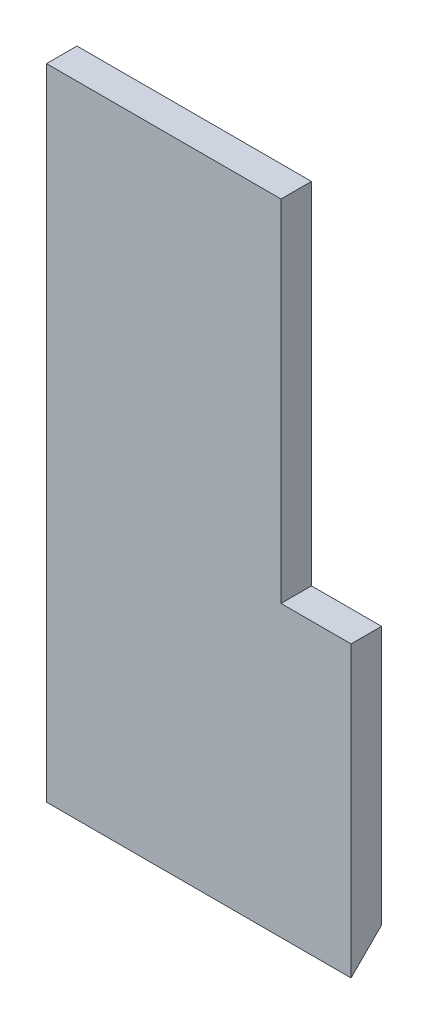
ISO-10303-21;
HEADER;
FILE_DESCRIPTION(('STEP AP214'),'2;1');
FILE_NAME('part.step','',(''),(''),'','','');
FILE_SCHEMA(('AUTOMOTIVE_DESIGN { 1 0 10303 214 1 1 1 1 }'));
ENDSEC;
DATA;
#1=APPLICATION_CONTEXT('core data for automotive mechanical design processes');
#2=APPLICATION_PROTOCOL_DEFINITION('international standard','automotive_design',2000,#1);
#3=PRODUCT_CONTEXT('',#1,'mechanical');
#4=PRODUCT('Part','Part','',(#3));
#5=PRODUCT_RELATED_PRODUCT_CATEGORY('part','',(#4));
#6=PRODUCT_DEFINITION_FORMATION('','',#4);
#7=PRODUCT_DEFINITION_CONTEXT('part definition',#1,'design');
#8=PRODUCT_DEFINITION('design','',#6,#7);
#9=PRODUCT_DEFINITION_SHAPE('','',#8);
#10=(LENGTH_UNIT() NAMED_UNIT(*) SI_UNIT(.MILLI.,.METRE.));
#11=(NAMED_UNIT(*) PLANE_ANGLE_UNIT() SI_UNIT($,.RADIAN.));
#12=(NAMED_UNIT(*) SI_UNIT($,.STERADIAN.) SOLID_ANGLE_UNIT());
#13=UNCERTAINTY_MEASURE_WITH_UNIT(LENGTH_MEASURE(1.E-05),#10,'distance_accuracy_value','');
#14=(GEOMETRIC_REPRESENTATION_CONTEXT(3) GLOBAL_UNCERTAINTY_ASSIGNED_CONTEXT((#13)) GLOBAL_UNIT_ASSIGNED_CONTEXT((#10,
#11,#12)) REPRESENTATION_CONTEXT('',''));
#15=CARTESIAN_POINT('',(0.,0.,0.));
#16=DIRECTION('',(0.,0.,1.));
#17=DIRECTION('',(1.,0.,0.));
#18=AXIS2_PLACEMENT_3D('',#15,#16,#17);
#19=CARTESIAN_POINT('',(-50.,-105.,10.));
#20=DIRECTION('',(-1.,0.,0.));
#21=DIRECTION('',(0.,0.,1.));
#22=AXIS2_PLACEMENT_3D('',#19,#20,#21);
#23=PLANE('',#22);
#24=DIRECTION('',(0.,-0.707106781186548,0.707106781186547));
#25=VECTOR('',#24,1.);
#26=CARTESIAN_POINT('',(-50.,-105.,10.));
#27=LINE('',#26,#25);
#28=CARTESIAN_POINT('',(-50.,-95.,0.));
#29=VERTEX_POINT('',#28);
#30=CARTESIAN_POINT('',(-50.,-105.,10.));
#31=VERTEX_POINT('',#30);
#32=EDGE_CURVE('E48',#29,#31,#27,.T.);
#33=ORIENTED_EDGE('',*,*,#32,.T.);
#34=DIRECTION('',(0.,1.,0.));
#35=VECTOR('',#34,1.);
#36=CARTESIAN_POINT('',(-50.,-105.,10.));
#37=LINE('',#36,#35);
#38=CARTESIAN_POINT('',(-50.,105.,10.));
#39=VERTEX_POINT('',#38);
#40=EDGE_CURVE('E102',#31,#39,#37,.T.);
#41=ORIENTED_EDGE('',*,*,#40,.T.);
#42=DIRECTION('',(0.,0.,-1.));
#43=VECTOR('',#42,1.);
#44=CARTESIAN_POINT('',(-50.,105.,10.));
#45=LINE('',#44,#43);
#46=CARTESIAN_POINT('',(-50.,105.,0.));
#47=VERTEX_POINT('',#46);
#48=EDGE_CURVE('E35',#39,#47,#45,.T.);
#49=ORIENTED_EDGE('',*,*,#48,.T.);
#50=DIRECTION('',(0.,1.,0.));
#51=VECTOR('',#50,1.);
#52=CARTESIAN_POINT('',(-50.,-105.,0.));
#53=LINE('',#52,#51);
#54=EDGE_CURVE('E103',#29,#47,#53,.T.);
#55=ORIENTED_EDGE('',*,*,#54,.F.);
#56=EDGE_LOOP('',(#33,#41,#49,#55));
#57=FACE_BOUND('',#56,.T.);
#58=ADVANCED_FACE('F32',(#57),#23,.T.);
#59=CARTESIAN_POINT('',(50.,-105.,10.));
#60=DIRECTION('',(-1.,0.,0.));
#61=DIRECTION('',(0.,0.,1.));
#62=AXIS2_PLACEMENT_3D('',#59,#60,#61);
#63=PLANE('',#62);
#64=DIRECTION('',(0.,1.,0.));
#65=VECTOR('',#64,1.);
#66=CARTESIAN_POINT('',(50.,-105.,10.));
#67=LINE('',#66,#65);
#68=CARTESIAN_POINT('',(50.,-105.,10.));
#69=VERTEX_POINT('',#68);
#70=CARTESIAN_POINT('',(50.,-10.,10.));
#71=VERTEX_POINT('',#70);
#72=EDGE_CURVE('E57',#69,#71,#67,.T.);
#73=ORIENTED_EDGE('',*,*,#72,.F.);
#74=DIRECTION('',(0.,-0.707106781186548,0.707106781186547));
#75=VECTOR('',#74,1.);
#76=CARTESIAN_POINT('',(50.,-105.,10.));
#77=LINE('',#76,#75);
#78=CARTESIAN_POINT('',(50.,-95.,0.));
#79=VERTEX_POINT('',#78);
#80=EDGE_CURVE('E96',#79,#69,#77,.T.);
#81=ORIENTED_EDGE('',*,*,#80,.F.);
#82=DIRECTION('',(0.,1.,0.));
#83=VECTOR('',#82,1.);
#84=CARTESIAN_POINT('',(50.,-105.,0.));
#85=LINE('',#84,#83);
#86=CARTESIAN_POINT('',(50.,-10.,0.));
#87=VERTEX_POINT('',#86);
#88=EDGE_CURVE('E79',#79,#87,#85,.T.);
#89=ORIENTED_EDGE('',*,*,#88,.T.);
#90=DIRECTION('',(0.,0.,-1.));
#91=VECTOR('',#90,1.);
#92=CARTESIAN_POINT('',(50.,-10.,10.));
#93=LINE('',#92,#91);
#94=EDGE_CURVE('E11',#71,#87,#93,.T.);
#95=ORIENTED_EDGE('',*,*,#94,.F.);
#96=EDGE_LOOP('',(#73,#81,#89,#95));
#97=FACE_BOUND('',#96,.T.);
#98=ADVANCED_FACE('F137',(#97),#63,.F.);
#99=CARTESIAN_POINT('',(27.,-10.,10.));
#100=DIRECTION('',(0.,1.,0.));
#101=DIRECTION('',(0.,0.,1.));
#102=AXIS2_PLACEMENT_3D('',#99,#100,#101);
#103=PLANE('',#102);
#104=DIRECTION('',(1.,0.,0.));
#105=VECTOR('',#104,1.);
#106=CARTESIAN_POINT('',(27.,-10.,0.));
#107=LINE('',#106,#105);
#108=CARTESIAN_POINT('',(27.,-10.,0.));
#109=VERTEX_POINT('',#108);
#110=EDGE_CURVE('E112',#109,#87,#107,.T.);
#111=ORIENTED_EDGE('',*,*,#110,.F.);
#112=DIRECTION('',(0.,0.,-1.));
#113=VECTOR('',#112,1.);
#114=CARTESIAN_POINT('',(27.,-10.,10.));
#115=LINE('',#114,#113);
#116=CARTESIAN_POINT('',(27.,-10.,10.));
#117=VERTEX_POINT('',#116);
#118=EDGE_CURVE('E40',#117,#109,#115,.T.);
#119=ORIENTED_EDGE('',*,*,#118,.F.);
#120=DIRECTION('',(1.,0.,0.));
#121=VECTOR('',#120,1.);
#122=CARTESIAN_POINT('',(27.,-10.,10.));
#123=LINE('',#122,#121);
#124=EDGE_CURVE('E119',#117,#71,#123,.T.);
#125=ORIENTED_EDGE('',*,*,#124,.T.);
#126=ORIENTED_EDGE('',*,*,#94,.T.);
#127=EDGE_LOOP('',(#111,#119,#125,#126));
#128=FACE_BOUND('',#127,.T.);
#129=ADVANCED_FACE('F140',(#128),#103,.T.);
#130=CARTESIAN_POINT('',(27.,105.,10.));
#131=DIRECTION('',(1.,0.,0.));
#132=DIRECTION('',(0.,1.,0.));
#133=AXIS2_PLACEMENT_3D('',#130,#131,#132);
#134=PLANE('',#133);
#135=DIRECTION('',(0.,-1.,0.));
#136=VECTOR('',#135,1.);
#137=CARTESIAN_POINT('',(27.,105.,0.));
#138=LINE('',#137,#136);
#139=CARTESIAN_POINT('',(27.,105.,0.));
#140=VERTEX_POINT('',#139);
#141=EDGE_CURVE('E127',#140,#109,#138,.T.);
#142=ORIENTED_EDGE('',*,*,#141,.F.);
#143=DIRECTION('',(0.,0.,-1.));
#144=VECTOR('',#143,1.);
#145=CARTESIAN_POINT('',(27.,105.,10.));
#146=LINE('',#145,#144);
#147=CARTESIAN_POINT('',(27.,105.,10.));
#148=VERTEX_POINT('',#147);
#149=EDGE_CURVE('E132',#148,#140,#146,.T.);
#150=ORIENTED_EDGE('',*,*,#149,.F.);
#151=DIRECTION('',(0.,-1.,0.));
#152=VECTOR('',#151,1.);
#153=CARTESIAN_POINT('',(27.,105.,10.));
#154=LINE('',#153,#152);
#155=EDGE_CURVE('E110',#148,#117,#154,.T.);
#156=ORIENTED_EDGE('',*,*,#155,.T.);
#157=ORIENTED_EDGE('',*,*,#118,.T.);
#158=EDGE_LOOP('',(#142,#150,#156,#157));
#159=FACE_BOUND('',#158,.T.);
#160=ADVANCED_FACE('F142',(#159),#134,.T.);
#161=CARTESIAN_POINT('',(-50.,105.,10.));
#162=DIRECTION('',(0.,1.,0.));
#163=DIRECTION('',(0.,0.,1.));
#164=AXIS2_PLACEMENT_3D('',#161,#162,#163);
#165=PLANE('',#164);
#166=DIRECTION('',(1.,0.,0.));
#167=VECTOR('',#166,1.);
#168=CARTESIAN_POINT('',(-50.,105.,0.));
#169=LINE('',#168,#167);
#170=EDGE_CURVE('E124',#47,#140,#169,.T.);
#171=ORIENTED_EDGE('',*,*,#170,.F.);
#172=ORIENTED_EDGE('',*,*,#48,.F.);
#173=DIRECTION('',(1.,0.,0.));
#174=VECTOR('',#173,1.);
#175=CARTESIAN_POINT('',(-50.,105.,10.));
#176=LINE('',#175,#174);
#177=EDGE_CURVE('E108',#39,#148,#176,.T.);
#178=ORIENTED_EDGE('',*,*,#177,.T.);
#179=ORIENTED_EDGE('',*,*,#149,.T.);
#180=EDGE_LOOP('',(#171,#172,#178,#179));
#181=FACE_BOUND('',#180,.T.);
#182=ADVANCED_FACE('F134',(#181),#165,.T.);
#183=CARTESIAN_POINT('',(0.,0.,10.));
#184=DIRECTION('',(0.,0.,-1.));
#185=DIRECTION('',(-1.,0.,0.));
#186=AXIS2_PLACEMENT_3D('',#183,#184,#185);
#187=PLANE('',#186);
#188=ORIENTED_EDGE('',*,*,#40,.F.);
#189=DIRECTION('',(1.,0.,0.));
#190=VECTOR('',#189,1.);
#191=CARTESIAN_POINT('',(-50.,-105.,10.));
#192=LINE('',#191,#190);
#193=EDGE_CURVE('E94',#31,#69,#192,.T.);
#194=ORIENTED_EDGE('',*,*,#193,.T.);
#195=ORIENTED_EDGE('',*,*,#72,.T.);
#196=ORIENTED_EDGE('',*,*,#124,.F.);
#197=ORIENTED_EDGE('',*,*,#155,.F.);
#198=ORIENTED_EDGE('',*,*,#177,.F.);
#199=EDGE_LOOP('',(#188,#194,#195,#196,#197,#198));
#200=FACE_BOUND('',#199,.T.);
#201=ADVANCED_FACE('F106',(#200),#187,.F.);
#202=CARTESIAN_POINT('',(0.,0.,0.));
#203=DIRECTION('',(0.,0.,-1.));
#204=DIRECTION('',(-1.,0.,0.));
#205=AXIS2_PLACEMENT_3D('',#202,#203,#204);
#206=PLANE('',#205);
#207=DIRECTION('',(1.,0.,0.));
#208=VECTOR('',#207,1.);
#209=CARTESIAN_POINT('',(-50.,-95.,0.));
#210=LINE('',#209,#208);
#211=EDGE_CURVE('E104',#29,#79,#210,.T.);
#212=ORIENTED_EDGE('',*,*,#211,.F.);
#213=ORIENTED_EDGE('',*,*,#54,.T.);
#214=ORIENTED_EDGE('',*,*,#170,.T.);
#215=ORIENTED_EDGE('',*,*,#141,.T.);
#216=ORIENTED_EDGE('',*,*,#110,.T.);
#217=ORIENTED_EDGE('',*,*,#88,.F.);
#218=EDGE_LOOP('',(#212,#213,#214,#215,#216,#217));
#219=FACE_BOUND('',#218,.T.);
#220=ADVANCED_FACE('F136',(#219),#206,.T.);
#221=CARTESIAN_POINT('',(-50.,-105.,10.));
#222=DIRECTION('',(0.,0.707106781186547,0.707106781186548));
#223=DIRECTION('',(0.,-0.707106781186548,0.707106781186547));
#224=AXIS2_PLACEMENT_3D('',#221,#222,#223);
#225=PLANE('',#224);
#226=ORIENTED_EDGE('',*,*,#80,.T.);
#227=ORIENTED_EDGE('',*,*,#193,.F.);
#228=ORIENTED_EDGE('',*,*,#32,.F.);
#229=ORIENTED_EDGE('',*,*,#211,.T.);
#230=EDGE_LOOP('',(#226,#227,#228,#229));
#231=FACE_BOUND('',#230,.T.);
#232=ADVANCED_FACE('F95',(#231),#225,.F.);
#233=CLOSED_SHELL('',(#58,#98,#129,#160,#182,#201,#220,#232));
#234=MANIFOLD_SOLID_BREP('B2',#233);
#235=ADVANCED_BREP_SHAPE_REPRESENTATION('',(#18,#234),#14);
#236=SHAPE_DEFINITION_REPRESENTATION(#9,#235);
ENDSEC;
END-ISO-10303-21;
